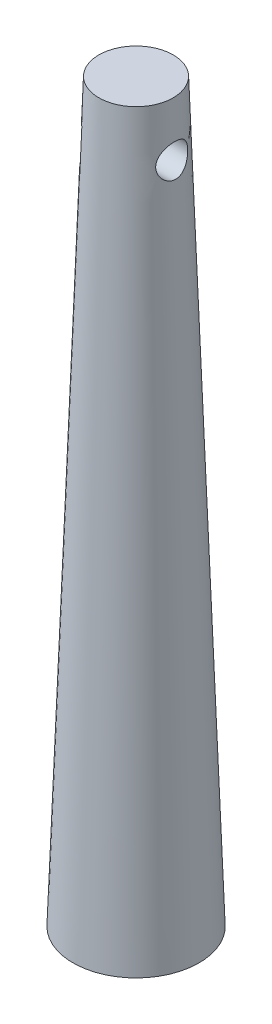
ISO-10303-21;
HEADER;
FILE_DESCRIPTION(('STEP AP214'),'2;1');
FILE_NAME('part.step','',(''),(''),'','','');
FILE_SCHEMA(('AUTOMOTIVE_DESIGN { 1 0 10303 214 1 1 1 1 }'));
ENDSEC;
DATA;
#1=APPLICATION_CONTEXT('core data for automotive mechanical design processes');
#2=APPLICATION_PROTOCOL_DEFINITION('international standard','automotive_design',2000,#1);
#3=PRODUCT_CONTEXT('',#1,'mechanical');
#4=PRODUCT('Part','Part','',(#3));
#5=PRODUCT_RELATED_PRODUCT_CATEGORY('part','',(#4));
#6=PRODUCT_DEFINITION_FORMATION('','',#4);
#7=PRODUCT_DEFINITION_CONTEXT('part definition',#1,'design');
#8=PRODUCT_DEFINITION('design','',#6,#7);
#9=PRODUCT_DEFINITION_SHAPE('','',#8);
#10=(LENGTH_UNIT() NAMED_UNIT(*) SI_UNIT(.MILLI.,.METRE.));
#11=(NAMED_UNIT(*) PLANE_ANGLE_UNIT() SI_UNIT($,.RADIAN.));
#12=(NAMED_UNIT(*) SI_UNIT($,.STERADIAN.) SOLID_ANGLE_UNIT());
#13=UNCERTAINTY_MEASURE_WITH_UNIT(LENGTH_MEASURE(1.E-05),#10,'distance_accuracy_value','');
#14=(GEOMETRIC_REPRESENTATION_CONTEXT(3) GLOBAL_UNCERTAINTY_ASSIGNED_CONTEXT((#13)) GLOBAL_UNIT_ASSIGNED_CONTEXT((#10,
#11,#12)) REPRESENTATION_CONTEXT('',''));
#15=CARTESIAN_POINT('',(0.,0.,0.));
#16=DIRECTION('',(0.,0.,1.));
#17=DIRECTION('',(1.,0.,0.));
#18=AXIS2_PLACEMENT_3D('',#15,#16,#17);
#19=CARTESIAN_POINT('',(6.0071,0.,0.));
#20=DIRECTION('',(0.,-1.,0.));
#21=DIRECTION('',(0.,0.,-1.));
#22=AXIS2_PLACEMENT_3D('',#19,#20,#21);
#23=PLANE('',#22);
#24=CARTESIAN_POINT('',(0.,0.,0.));
#25=DIRECTION('',(0.,-1.,0.));
#26=DIRECTION('',(0.,0.,-1.));
#27=AXIS2_PLACEMENT_3D('',#24,#25,#26);
#28=CIRCLE('',#27,6.0071);
#29=CARTESIAN_POINT('',(0.,0.,-6.0071));
#30=VERTEX_POINT('',#29);
#31=EDGE_CURVE('E48',#30,#30,#28,.T.);
#32=ORIENTED_EDGE('',*,*,#31,.T.);
#33=EDGE_LOOP('',(#32));
#34=FACE_BOUND('',#33,.T.);
#35=ADVANCED_FACE('F37',(#34),#23,.T.);
#36=CARTESIAN_POINT('',(0.,70.1548,0.));
#37=DIRECTION('',(0.,1.,0.));
#38=DIRECTION('',(0.,0.,1.));
#39=AXIS2_PLACEMENT_3D('',#36,#37,#38);
#40=PLANE('',#39);
#41=CARTESIAN_POINT('',(0.,70.1548,0.));
#42=DIRECTION('',(0.,-1.,0.));
#43=DIRECTION('',(0.,0.,-1.));
#44=AXIS2_PLACEMENT_3D('',#41,#42,#43);
#45=CIRCLE('',#44,3.5433);
#46=CARTESIAN_POINT('',(0.,70.1548,-3.5433));
#47=VERTEX_POINT('',#46);
#48=EDGE_CURVE('E10',#47,#47,#45,.T.);
#49=ORIENTED_EDGE('',*,*,#48,.F.);
#50=EDGE_LOOP('',(#49));
#51=FACE_BOUND('',#50,.T.);
#52=ADVANCED_FACE('F68',(#51),#40,.T.);
#53=CARTESIAN_POINT('',(0.,0.,0.));
#54=DIRECTION('',(0.,-1.,0.));
#55=DIRECTION('',(0.,0.,-1.));
#56=AXIS2_PLACEMENT_3D('',#53,#54,#55);
#57=CONICAL_SURFACE('',#56,6.0071,0.0351050507859617);
#58=CARTESIAN_POINT('',(-3.60750814056581,63.9802720144687,-1.06046427987401));
#59=CARTESIAN_POINT('',(-3.62727511567842,63.9221348267773,-1.00045364201478));
#60=CARTESIAN_POINT('',(-3.64664942433172,63.8688044997939,-0.935522515541793));
#61=CARTESIAN_POINT('',(-3.68281301139513,63.7731806569853,-0.797155138967053));
#62=CARTESIAN_POINT('',(-3.69959679580546,63.7309104691656,-0.723701376221848));
#63=CARTESIAN_POINT('',(-3.72895620141484,63.6588017584417,-0.569868678228432));
#64=CARTESIAN_POINT('',(-3.7415213410616,63.6289941554289,-0.489473108889549));
#65=CARTESIAN_POINT('',(-3.76105472058366,63.5832283631119,-0.324232949657836));
#66=CARTESIAN_POINT('',(-3.76802844426753,63.5672566029973,-0.239392806040288));
#67=CARTESIAN_POINT('',(-3.77540973423131,63.550372518455,-0.0728253720891194));
#68=CARTESIAN_POINT('',(-3.77616735801532,63.5486572674365,0.00880546673128798));
#69=CARTESIAN_POINT('',(-3.77195924217417,63.5582594344916,0.171145492508763));
#70=CARTESIAN_POINT('',(-3.76699364569621,63.5695765266048,0.251854702466307));
#71=CARTESIAN_POINT('',(-3.752079909033,63.6041844828983,0.40745743841464));
#72=CARTESIAN_POINT('',(-3.74229384978999,63.6270864558413,0.482454102736594));
#73=CARTESIAN_POINT('',(-3.71870162383172,63.6838025893,0.627511714818948));
#74=CARTESIAN_POINT('',(-3.70489474455044,63.7176186841213,0.697571784985118));
#75=CARTESIAN_POINT('',(-3.67362214005476,63.7971546052474,0.83474943976109));
#76=CARTESIAN_POINT('',(-3.65600395179801,63.8434002402696,0.90152669805098));
#77=CARTESIAN_POINT('',(-3.61912428887122,63.9456157961505,1.02667125773868));
#78=CARTESIAN_POINT('',(-3.59986202095914,64.0015904247452,1.08503446255497));
#79=CARTESIAN_POINT('',(-3.55989563442382,64.1265833739826,1.19623192802967));
#80=CARTESIAN_POINT('',(-3.53919171520091,64.196265075535,1.24832334379722));
#81=CARTESIAN_POINT('',(-3.49990883749376,64.3439230857169,1.34013131741999));
#82=CARTESIAN_POINT('',(-3.48133006894314,64.421900134536,1.37984676972961));
#83=CARTESIAN_POINT('',(-3.44837475545973,64.5843223710129,1.44557212019475));
#84=CARTESIAN_POINT('',(-3.4339989298755,64.6687686627866,1.47157967280552));
#85=CARTESIAN_POINT('',(-3.41124460004353,64.8416386020409,1.50864459253702));
#86=CARTESIAN_POINT('',(-3.40286102165937,64.9300588168636,1.51971461558247));
#87=CARTESIAN_POINT('',(-3.39350295022787,65.1003882105403,1.52596449188001));
#88=CARTESIAN_POINT('',(-3.39196644286227,65.1822220800541,1.52239821714844));
#89=CARTESIAN_POINT('',(-3.39473065271451,65.3441574915189,1.50222426420938));
#90=CARTESIAN_POINT('',(-3.39903096460586,65.4242591533673,1.48561749160753));
#91=CARTESIAN_POINT('',(-3.41240737263615,65.5775382860817,1.44082602530834));
#92=CARTESIAN_POINT('',(-3.42130547494645,65.6508613273228,1.41308089599932));
#93=CARTESIAN_POINT('',(-3.44255248488881,65.7919959711685,1.34695344473409));
#94=CARTESIAN_POINT('',(-3.45490233589161,65.8598060605216,1.30856821483794));
#95=CARTESIAN_POINT('',(-3.48245462482519,65.9925874852927,1.2194392963793));
#96=CARTESIAN_POINT('',(-3.4977876971114,66.0571113854487,1.16806973588871));
#97=CARTESIAN_POINT('',(-3.52893828447165,66.177012002291,1.05568075574567));
#98=CARTESIAN_POINT('',(-3.5447559834622,66.2323851939977,0.994657635042836));
#99=CARTESIAN_POINT('',(-3.57603559019232,66.3356343167486,0.860490163025802));
#100=CARTESIAN_POINT('',(-3.59142362696629,66.382888976634,0.786848006113664));
#101=CARTESIAN_POINT('',(-3.61896313357753,66.4642910271339,0.632083326206841));
#102=CARTESIAN_POINT('',(-3.63111535978919,66.498441481696,0.5509625573251));
#103=CARTESIAN_POINT('',(-3.65041783429518,66.551616045406,0.385870601160127));
#104=CARTESIAN_POINT('',(-3.65769903534007,66.5710382169677,0.302043551864813));
#105=CARTESIAN_POINT('',(-3.66691039884466,66.5954932978001,0.132039666987805));
#106=CARTESIAN_POINT('',(-3.66884276465127,66.6005321320291,0.0458638137268119));
#107=CARTESIAN_POINT('',(-3.66717568725392,66.5961442571109,-0.121054029482528));
#108=CARTESIAN_POINT('',(-3.66388953453719,66.5875368424425,-0.201822190465947));
#109=CARTESIAN_POINT('',(-3.65272960929951,66.5577132756307,-0.360658360483711));
#110=CARTESIAN_POINT('',(-3.64485572061525,66.5364968042206,-0.438726301094371));
#111=CARTESIAN_POINT('',(-3.62533911740323,66.4821562553061,-0.590272526495619));
#112=CARTESIAN_POINT('',(-3.61368814677654,66.4490060749235,-0.663740332506474));
#113=CARTESIAN_POINT('',(-3.58782240152663,66.3718121856091,-0.804216413259017));
#114=CARTESIAN_POINT('',(-3.57360685060207,66.3277651766918,-0.871222722648092));
#115=CARTESIAN_POINT('',(-3.54317963619614,66.227013715772,-1.00105935891704));
#116=CARTESIAN_POINT('',(-3.52689987522006,66.1697201258545,-1.06341701058695));
#117=CARTESIAN_POINT('',(-3.49494004942733,66.0455063508881,-1.17789761715035));
#118=CARTESIAN_POINT('',(-3.47926019162798,65.9785828799771,-1.23001706419664));
#119=CARTESIAN_POINT('',(-3.45001407778033,65.834446258476,-1.324060823972));
#120=CARTESIAN_POINT('',(-3.43652642205812,65.7569824416393,-1.36562766482643));
#121=CARTESIAN_POINT('',(-3.41430603029205,65.595487350097,-1.43498089006686));
#122=CARTESIAN_POINT('',(-3.40557034418363,65.5114601871168,-1.4627758232167));
#123=CARTESIAN_POINT('',(-3.39474588582146,65.3444518000049,-1.50226273635195));
#124=CARTESIAN_POINT('',(-3.3923006387366,65.2616931053359,-1.5147959642452));
#125=CARTESIAN_POINT('',(-3.39362165879864,65.0953118383509,-1.52613928565072));
#126=CARTESIAN_POINT('',(-3.39738526023269,65.0116896520836,-1.52495526722405));
#127=CARTESIAN_POINT('',(-3.41043365883092,64.8510983905891,-1.50952416534943));
#128=CARTESIAN_POINT('',(-3.41938350358271,64.7740258044926,-1.49604329122379));
#129=CARTESIAN_POINT('',(-3.44165412857197,64.6233915637092,-1.45768745038137));
#130=CARTESIAN_POINT('',(-3.45497827088359,64.5498326596021,-1.43280371361155));
#131=CARTESIAN_POINT('',(-3.48539223397446,64.4047354055912,-1.37116041808074));
#132=CARTESIAN_POINT('',(-3.5026225883649,64.3334304712391,-1.33392410861805));
#133=CARTESIAN_POINT('',(-3.53882183139619,64.1979672552648,-1.24904423130472));
#134=CARTESIAN_POINT('',(-3.55778747508469,64.1337961121553,-1.20141986698215));
#135=CARTESIAN_POINT('',(-3.58705920177024,64.0413821099608,-1.12092647706869));
#136=CARTESIAN_POINT('',(-3.59733566676156,64.0101905536217,-1.09134693329577));
#137=CARTESIAN_POINT('',(-3.60750814056581,63.9802720144687,-1.06046427987401));
#138=B_SPLINE_CURVE_WITH_KNOTS('',3,(#58,#59,#60,#61,#62,#63,#64,#65,#66,#67,#68,#69,#70,#71,
#72,#73,#74,#75,#76,#77,#78,#79,#80,#81,#82,#83,#84,#85,#86,#87,#88,#89,#90,#91,#92,#93,#94,#95,
#96,#97,#98,#99,#100,#101,#102,#103,#104,#105,#106,#107,#108,#109,#110,#111,#112,#113,#114,#115,
#116,#117,#118,#119,#120,#121,#122,#123,#124,#125,#126,#127,#128,#129,#130,#131,#132,#133,#134,
#135,#136,#137),.UNSPECIFIED.,.T.,.F.,(4,2,2,2,2,2,2,2,2,2,2,2,2,2,2,2,2,2,2,2,2,2,2,2,2,2,2,2,
2,2,2,2,2,2,2,2,2,2,2,4),(0.,0.257454780002063,0.515448283407458,0.774078128482466,
1.0324540097318,1.27617209838337,1.51988409137393,1.75590978181799,1.99197732599731,
2.24027126159894,2.48868567966624,2.7557291102974,3.02279638910111,3.28990935069155,
3.5567958565871,3.80131700021286,4.04582116441436,4.28149950667051,4.51724232344223,
4.76782565804505,5.01850529693664,5.28372713920588,5.54888693103676,5.80659618147488,
6.06419925787401,6.30691250515634,6.54963189830213,6.79288545557116,7.03621276989258,
7.29375584802344,7.55138701308693,7.81683807765293,8.08212415924209,8.33200760411569,
8.58178379171557,8.81698651840304,9.05237044620664,9.2981693704447,9.54351770064475,
9.6760089892931),.UNSPECIFIED.);
#139=CARTESIAN_POINT('',(-3.60750814056581,63.9802720144687,-1.06046427987401));
#140=VERTEX_POINT('',#139);
#141=EDGE_CURVE('E40',#140,#140,#138,.T.);
#142=ORIENTED_EDGE('',*,*,#141,.F.);
#143=EDGE_LOOP('',(#142));
#144=FACE_BOUND('',#143,.T.);
#145=CARTESIAN_POINT('',(3.60750814056581,63.9802720144687,-1.06046427987401));
#146=CARTESIAN_POINT('',(3.58720872580349,64.0399741995385,-1.12207816477793));
#147=CARTESIAN_POINT('',(3.56644702595257,64.1048920533635,-1.17865365777378));
#148=CARTESIAN_POINT('',(3.52604130814615,64.24368661063,-1.28033521131125));
#149=CARTESIAN_POINT('',(3.50640034475278,64.3175862261879,-1.32541098979672));
#150=CARTESIAN_POINT('',(3.47031262320814,64.4727828491195,-1.40273770204331));
#151=CARTESIAN_POINT('',(3.45387232918554,64.5540943495033,-1.43496281711987));
#152=CARTESIAN_POINT('',(3.42618817820911,64.7217848963473,-1.48512555087052));
#153=CARTESIAN_POINT('',(3.41493763988335,64.8081572649087,-1.50308156146865));
#154=CARTESIAN_POINT('',(3.3994655579625,64.978205887221,-1.52320153091952));
#155=CARTESIAN_POINT('',(3.39487288604299,65.0617462990317,-1.52622412308052));
#156=CARTESIAN_POINT('',(3.3919104023161,65.2283033794107,-1.51853824677559));
#157=CARTESIAN_POINT('',(3.39353974342122,65.3113201177325,-1.50783164758358));
#158=CARTESIAN_POINT('',(3.40226235067732,65.4693955713902,-1.4741173294174));
#159=CARTESIAN_POINT('',(3.40903100924182,65.5446359147942,-1.45186440923298));
#160=CARTESIAN_POINT('',(3.4266296783835,65.6904068356719,-1.39631361132929));
#161=CARTESIAN_POINT('',(3.4374605584115,65.7609364010723,-1.36301336929113));
#162=CARTESIAN_POINT('',(3.46238578023379,65.8987935500262,-1.28459383581597));
#163=CARTESIAN_POINT('',(3.47660534487664,65.9658329699405,-1.23900896514925));
#164=CARTESIAN_POINT('',(3.50632600543023,66.09170810978,-1.13797753882859));
#165=CARTESIAN_POINT('',(3.52182761441462,66.1505405197096,-1.08252702462761));
#166=CARTESIAN_POINT('',(3.55352491057027,66.262601185687,-0.958726264780306));
#167=CARTESIAN_POINT('',(3.56969215872309,66.3151389158955,-0.889741090161223));
#168=CARTESIAN_POINT('',(3.59966459154011,66.4079546192859,-0.743487315391434));
#169=CARTESIAN_POINT('',(3.613469882691,66.4482331452268,-0.666219088930216));
#170=CARTESIAN_POINT('',(3.6369821110888,66.5149352527544,-0.506016969438418));
#171=CARTESIAN_POINT('',(3.64671970954812,66.5414628650106,-0.423131146410499));
#172=CARTESIAN_POINT('',(3.66105114994065,66.580053176531,-0.253639900513184));
#173=CARTESIAN_POINT('',(3.66564745193088,66.5921227939919,-0.167036277189229));
#174=CARTESIAN_POINT('',(3.66901988728556,66.600998304018,0.00177665901955219));
#175=CARTESIAN_POINT('',(3.66813200616207,66.5986852806194,0.0839340388642819));
#176=CARTESIAN_POINT('',(3.66141972917826,66.5809392499444,0.246603923164189));
#177=CARTESIAN_POINT('',(3.65559563956098,66.5655070565828,0.327116529344011));
#178=CARTESIAN_POINT('',(3.63978632764966,66.522473412791,0.482961115781119));
#179=CARTESIAN_POINT('',(3.62986933188639,66.4950710796958,0.558355469025443));
#180=CARTESIAN_POINT('',(3.60690925025229,66.4290429524891,0.703538301120958));
#181=CARTESIAN_POINT('',(3.59386543420873,66.390414536423,0.773325465495752));
#182=CARTESIAN_POINT('',(3.56524600517732,66.3007569379348,0.909153270542064));
#183=CARTESIAN_POINT('',(3.54957549688196,66.2491978940508,0.974824018007285));
#184=CARTESIAN_POINT('',(3.51793912064584,66.1361021978923,1.09687796406885));
#185=CARTESIAN_POINT('',(3.50197312970303,66.0745613037153,1.15325719350094));
#186=CARTESIAN_POINT('',(3.47088973122268,65.9398076153159,1.25774992556768));
#187=CARTESIAN_POINT('',(3.45584538858553,65.8661874973305,1.30536247856454));
#188=CARTESIAN_POINT('',(3.4295771619719,65.7113361854784,1.38746836693293));
#189=CARTESIAN_POINT('',(3.41835170465507,65.630108143629,1.42196710574633));
#190=CARTESIAN_POINT('',(3.4018923618611,65.4656374821038,1.47546702081811));
#191=CARTESIAN_POINT('',(3.39644165710641,65.3825973411838,1.49502068488746));
#192=CARTESIAN_POINT('',(3.39182468621408,65.2142643059087,1.51998528989323));
#193=CARTESIAN_POINT('',(3.39265504065483,65.1289726475597,1.52540383389046));
#194=CARTESIAN_POINT('',(3.40044343286703,64.965104776978,1.5220963028097));
#195=CARTESIAN_POINT('',(3.40695875606209,64.88648474144,1.51435459526542));
#196=CARTESIAN_POINT('',(3.4249029305169,64.7319244844073,1.48700182517015));
#197=CARTESIAN_POINT('',(3.43633266441033,64.6559847469495,1.46738863022855));
#198=CARTESIAN_POINT('',(3.4632259511069,64.5072503257805,1.41659999982177));
#199=CARTESIAN_POINT('',(3.47875998975306,64.4345394403504,1.38521805964518));
#200=CARTESIAN_POINT('',(3.51228537078875,64.2952623677168,1.31190579704905));
#201=CARTESIAN_POINT('',(3.53027766890919,64.2286985873585,1.26997136663041));
#202=CARTESIAN_POINT('',(3.56874831365883,64.0975261264507,1.17249700659693));
#203=CARTESIAN_POINT('',(3.58930734386512,64.0335788917048,1.11609667386587));
#204=CARTESIAN_POINT('',(3.62951096640409,63.9158054362555,0.993252751376449));
#205=CARTESIAN_POINT('',(3.64915527009733,63.8619823941459,0.926806019219772));
#206=CARTESIAN_POINT('',(3.68622189153064,63.7644015221928,0.783074508300332));
#207=CARTESIAN_POINT('',(3.70355560131537,63.7210107412062,0.705515955153868));
#208=CARTESIAN_POINT('',(3.73339111175088,63.6481451259454,0.543257217239906));
#209=CARTESIAN_POINT('',(3.74589552874352,63.6186627546583,0.458560929832536));
#210=CARTESIAN_POINT('',(3.76405226157756,63.5763270209038,0.290181192322216));
#211=CARTESIAN_POINT('',(3.77008961465975,63.5625357405752,0.206775591514746));
#212=CARTESIAN_POINT('',(3.77603134973151,63.5489601606412,0.0386373118933424));
#213=CARTESIAN_POINT('',(3.77593893728169,63.5491685399153,-0.0460946501215576));
#214=CARTESIAN_POINT('',(3.76984468426669,63.5630979435208,-0.208732912597103));
#215=CARTESIAN_POINT('',(3.76422039045711,63.575955672016,-0.286729693482142));
#216=CARTESIAN_POINT('',(3.74814698843177,63.6133946443476,-0.43937347565062));
#217=CARTESIAN_POINT('',(3.73769495003722,63.6379830083412,-0.514018412314316));
#218=CARTESIAN_POINT('',(3.71265736859977,63.6985798398261,-0.659492808758119));
#219=CARTESIAN_POINT('',(3.69799509426202,63.7348019369593,-0.730219298165145));
#220=CARTESIAN_POINT('',(3.66591102473989,63.817357432166,-0.864649414922148));
#221=CARTESIAN_POINT('',(3.64849437834293,63.8636720240586,-0.928365776867471));
#222=CARTESIAN_POINT('',(3.62288476558392,63.9356061102374,-1.01286022864819));
#223=CARTESIAN_POINT('',(3.61522989916033,63.9575617114342,-1.03702677929237));
#224=CARTESIAN_POINT('',(3.60750814056581,63.9802720144687,-1.06046427987401));
#225=B_SPLINE_CURVE_WITH_KNOTS('',3,(#145,#146,#147,#148,#149,#150,#151,#152,#153,#154,#155,
#156,#157,#158,#159,#160,#161,#162,#163,#164,#165,#166,#167,#168,#169,#170,#171,#172,#173,#174,
#175,#176,#177,#178,#179,#180,#181,#182,#183,#184,#185,#186,#187,#188,#189,#190,#191,#192,#193,
#194,#195,#196,#197,#198,#199,#200,#201,#202,#203,#204,#205,#206,#207,#208,#209,#210,#211,#212,
#213,#214,#215,#216,#217,#218,#219,#220,#221,#222,#223,#224),.UNSPECIFIED.,.T.,.F.,(4,2,2,2,2,2,
2,2,2,2,2,2,2,2,2,2,2,2,2,2,2,2,2,2,2,2,2,2,2,2,2,2,2,2,2,2,2,2,2,4),(0.,0.264398476241047,
0.529486165892252,0.79510380042808,1.06037851371221,1.31020732266521,1.56000212022696,
1.79521078369297,2.03046981841053,2.27634632549423,2.52232171288185,2.78569178127553,
3.0490499727377,3.31038556491243,3.57159605715601,3.81696912496416,4.06232697090836,
4.30375020633128,4.54522987374143,4.79896498935202,5.05280821650999,5.31835516108309,
5.5837925702585,5.83886640652626,6.09380301423573,6.3304977683594,6.56723505089592,
6.80833702940707,7.04953301256289,7.31148986482575,7.57352882434334,7.84375551416447,
8.11383559856397,8.36674765012374,8.61952744238088,8.8561735194887,9.09296341703348,
9.33437722219349,9.57534497017111,9.67592034291943),.UNSPECIFIED.);
#226=CARTESIAN_POINT('',(3.60750814056581,63.9802720144687,-1.06046427987401));
#227=VERTEX_POINT('',#226);
#228=EDGE_CURVE('E54',#227,#227,#225,.T.);
#229=ORIENTED_EDGE('',*,*,#228,.F.);
#230=EDGE_LOOP('',(#229));
#231=FACE_BOUND('',#230,.T.);
#232=ORIENTED_EDGE('',*,*,#48,.T.);
#233=EDGE_LOOP('',(#232));
#234=FACE_BOUND('',#233,.T.);
#235=ORIENTED_EDGE('',*,*,#31,.F.);
#236=EDGE_LOOP('',(#235));
#237=FACE_BOUND('',#236,.T.);
#238=ADVANCED_FACE('F58',(#144,#231,#234,#237),#57,.T.);
#239=CARTESIAN_POINT('',(-6.0071,65.0748,0.));
#240=DIRECTION('',(1.,0.,0.));
#241=DIRECTION('',(0.,0.,-1.));
#242=AXIS2_PLACEMENT_3D('',#239,#240,#241);
#243=CYLINDRICAL_SURFACE('',#242,1.524);
#244=ORIENTED_EDGE('',*,*,#141,.T.);
#245=EDGE_LOOP('',(#244));
#246=FACE_BOUND('',#245,.T.);
#247=ORIENTED_EDGE('',*,*,#228,.T.);
#248=EDGE_LOOP('',(#247));
#249=FACE_BOUND('',#248,.T.);
#250=ADVANCED_FACE('F60',(#246,#249),#243,.F.);
#251=CLOSED_SHELL('',(#35,#52,#238,#250));
#252=MANIFOLD_SOLID_BREP('B2',#251);
#253=ADVANCED_BREP_SHAPE_REPRESENTATION('',(#18,#252),#14);
#254=SHAPE_DEFINITION_REPRESENTATION(#9,#253);
ENDSEC;
END-ISO-10303-21;
